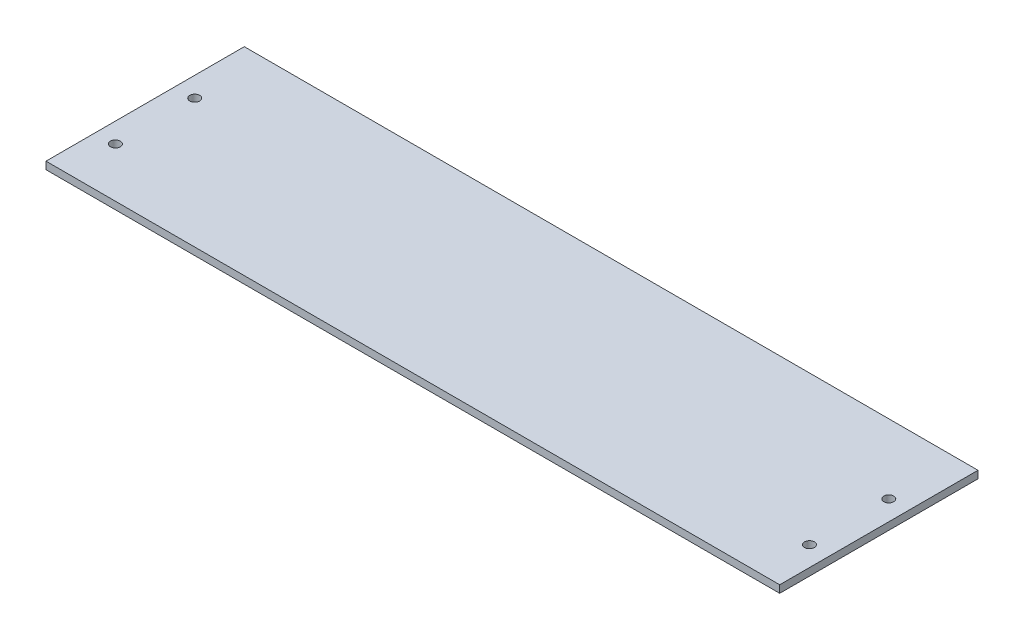
ISO-10303-21;
HEADER;
FILE_DESCRIPTION(('STEP AP214'),'2;1');
FILE_NAME('part.step','',(''),(''),'','','');
FILE_SCHEMA(('AUTOMOTIVE_DESIGN { 1 0 10303 214 1 1 1 1 }'));
ENDSEC;
DATA;
#1=APPLICATION_CONTEXT('core data for automotive mechanical design processes');
#2=APPLICATION_PROTOCOL_DEFINITION('international standard','automotive_design',2000,#1);
#3=PRODUCT_CONTEXT('',#1,'mechanical');
#4=PRODUCT('Part','Part','',(#3));
#5=PRODUCT_RELATED_PRODUCT_CATEGORY('part','',(#4));
#6=PRODUCT_DEFINITION_FORMATION('','',#4);
#7=PRODUCT_DEFINITION_CONTEXT('part definition',#1,'design');
#8=PRODUCT_DEFINITION('design','',#6,#7);
#9=PRODUCT_DEFINITION_SHAPE('','',#8);
#10=(LENGTH_UNIT() NAMED_UNIT(*) SI_UNIT(.MILLI.,.METRE.));
#11=(NAMED_UNIT(*) PLANE_ANGLE_UNIT() SI_UNIT($,.RADIAN.));
#12=(NAMED_UNIT(*) SI_UNIT($,.STERADIAN.) SOLID_ANGLE_UNIT());
#13=UNCERTAINTY_MEASURE_WITH_UNIT(LENGTH_MEASURE(1.E-05),#10,'distance_accuracy_value','');
#14=(GEOMETRIC_REPRESENTATION_CONTEXT(3) GLOBAL_UNCERTAINTY_ASSIGNED_CONTEXT((#13)) GLOBAL_UNIT_ASSIGNED_CONTEXT((#10,
#11,#12)) REPRESENTATION_CONTEXT('',''));
#15=CARTESIAN_POINT('',(0.,0.,0.));
#16=DIRECTION('',(0.,0.,1.));
#17=DIRECTION('',(1.,0.,0.));
#18=AXIS2_PLACEMENT_3D('',#15,#16,#17);
#19=CARTESIAN_POINT('',(0.,3.,0.));
#20=DIRECTION('',(0.,1.,0.));
#21=DIRECTION('',(0.,0.,1.));
#22=AXIS2_PLACEMENT_3D('',#19,#20,#21);
#23=PLANE('',#22);
#24=CARTESIAN_POINT('',(-288.,3.,-52.));
#25=DIRECTION('',(0.,1.,0.));
#26=DIRECTION('',(0.,0.,-1.));
#27=AXIS2_PLACEMENT_3D('',#24,#25,#26);
#28=CIRCLE('',#27,2.);
#29=CARTESIAN_POINT('',(-288.,3.,-54.));
#30=VERTEX_POINT('',#29);
#31=EDGE_CURVE('E148',#30,#30,#28,.T.);
#32=ORIENTED_EDGE('',*,*,#31,.F.);
#33=EDGE_LOOP('',(#32));
#34=FACE_BOUND('',#33,.T.);
#35=CARTESIAN_POINT('',(-8.,3.,-20.));
#36=DIRECTION('',(0.,1.,0.));
#37=DIRECTION('',(0.,0.,1.));
#38=AXIS2_PLACEMENT_3D('',#35,#36,#37);
#39=CIRCLE('',#38,2.);
#40=CARTESIAN_POINT('',(-8.,3.,-18.));
#41=VERTEX_POINT('',#40);
#42=EDGE_CURVE('E118',#41,#41,#39,.T.);
#43=ORIENTED_EDGE('',*,*,#42,.F.);
#44=EDGE_LOOP('',(#43));
#45=FACE_BOUND('',#44,.T.);
#46=DIRECTION('',(0.,0.,-1.));
#47=VECTOR('',#46,1.);
#48=CARTESIAN_POINT('',(0.,3.,0.));
#49=LINE('',#48,#47);
#50=CARTESIAN_POINT('',(0.,3.,0.));
#51=VERTEX_POINT('',#50);
#52=CARTESIAN_POINT('',(0.,3.,-80.));
#53=VERTEX_POINT('',#52);
#54=EDGE_CURVE('E98',#51,#53,#49,.T.);
#55=ORIENTED_EDGE('',*,*,#54,.T.);
#56=DIRECTION('',(-1.,0.,0.));
#57=VECTOR('',#56,1.);
#58=CARTESIAN_POINT('',(0.,3.,-80.));
#59=LINE('',#58,#57);
#60=CARTESIAN_POINT('',(-296.,3.,-80.));
#61=VERTEX_POINT('',#60);
#62=EDGE_CURVE('E93',#53,#61,#59,.T.);
#63=ORIENTED_EDGE('',*,*,#62,.T.);
#64=DIRECTION('',(0.,0.,1.));
#65=VECTOR('',#64,1.);
#66=CARTESIAN_POINT('',(-296.,3.,0.));
#67=LINE('',#66,#65);
#68=CARTESIAN_POINT('',(-296.,3.,0.));
#69=VERTEX_POINT('',#68);
#70=EDGE_CURVE('E96',#61,#69,#67,.T.);
#71=ORIENTED_EDGE('',*,*,#70,.T.);
#72=DIRECTION('',(1.,0.,0.));
#73=VECTOR('',#72,1.);
#74=CARTESIAN_POINT('',(0.,3.,0.));
#75=LINE('',#74,#73);
#76=EDGE_CURVE('E63',#69,#51,#75,.T.);
#77=ORIENTED_EDGE('',*,*,#76,.T.);
#78=EDGE_LOOP('',(#55,#63,#71,#77));
#79=FACE_BOUND('',#78,.T.);
#80=CARTESIAN_POINT('',(-8.,3.,-52.));
#81=DIRECTION('',(0.,1.,0.));
#82=DIRECTION('',(0.,0.,1.));
#83=AXIS2_PLACEMENT_3D('',#80,#81,#82);
#84=CIRCLE('',#83,2.);
#85=CARTESIAN_POINT('',(-8.,3.,-50.));
#86=VERTEX_POINT('',#85);
#87=EDGE_CURVE('E140',#86,#86,#84,.T.);
#88=ORIENTED_EDGE('',*,*,#87,.F.);
#89=EDGE_LOOP('',(#88));
#90=FACE_BOUND('',#89,.T.);
#91=CARTESIAN_POINT('',(-288.,3.,-20.));
#92=DIRECTION('',(0.,1.,0.));
#93=DIRECTION('',(0.,0.,-1.));
#94=AXIS2_PLACEMENT_3D('',#91,#92,#93);
#95=CIRCLE('',#94,2.);
#96=CARTESIAN_POINT('',(-288.,3.,-22.));
#97=VERTEX_POINT('',#96);
#98=EDGE_CURVE('E156',#97,#97,#95,.T.);
#99=ORIENTED_EDGE('',*,*,#98,.F.);
#100=EDGE_LOOP('',(#99));
#101=FACE_BOUND('',#100,.T.);
#102=ADVANCED_FACE('F45',(#34,#45,#79,#90,#101),#23,.T.);
#103=CARTESIAN_POINT('',(0.,0.,0.));
#104=DIRECTION('',(0.,1.,0.));
#105=DIRECTION('',(0.,0.,1.));
#106=AXIS2_PLACEMENT_3D('',#103,#104,#105);
#107=PLANE('',#106);
#108=DIRECTION('',(0.,0.,-1.));
#109=VECTOR('',#108,1.);
#110=CARTESIAN_POINT('',(0.,0.,0.));
#111=LINE('',#110,#109);
#112=CARTESIAN_POINT('',(0.,0.,0.));
#113=VERTEX_POINT('',#112);
#114=CARTESIAN_POINT('',(0.,0.,-80.));
#115=VERTEX_POINT('',#114);
#116=EDGE_CURVE('E114',#113,#115,#111,.T.);
#117=ORIENTED_EDGE('',*,*,#116,.F.);
#118=DIRECTION('',(1.,0.,0.));
#119=VECTOR('',#118,1.);
#120=CARTESIAN_POINT('',(0.,0.,0.));
#121=LINE('',#120,#119);
#122=CARTESIAN_POINT('',(-296.,0.,0.));
#123=VERTEX_POINT('',#122);
#124=EDGE_CURVE('E86',#123,#113,#121,.T.);
#125=ORIENTED_EDGE('',*,*,#124,.F.);
#126=DIRECTION('',(0.,0.,1.));
#127=VECTOR('',#126,1.);
#128=CARTESIAN_POINT('',(-296.,0.,0.));
#129=LINE('',#128,#127);
#130=CARTESIAN_POINT('',(-296.,0.,-80.));
#131=VERTEX_POINT('',#130);
#132=EDGE_CURVE('E80',#131,#123,#129,.T.);
#133=ORIENTED_EDGE('',*,*,#132,.F.);
#134=DIRECTION('',(-1.,0.,0.));
#135=VECTOR('',#134,1.);
#136=CARTESIAN_POINT('',(0.,0.,-80.));
#137=LINE('',#136,#135);
#138=EDGE_CURVE('E103',#115,#131,#137,.T.);
#139=ORIENTED_EDGE('',*,*,#138,.F.);
#140=EDGE_LOOP('',(#117,#125,#133,#139));
#141=FACE_BOUND('',#140,.T.);
#142=CARTESIAN_POINT('',(-8.,0.,-20.));
#143=DIRECTION('',(0.,1.,0.));
#144=DIRECTION('',(0.,0.,1.));
#145=AXIS2_PLACEMENT_3D('',#142,#143,#144);
#146=CIRCLE('',#145,2.);
#147=CARTESIAN_POINT('',(-8.,0.,-18.));
#148=VERTEX_POINT('',#147);
#149=EDGE_CURVE('E136',#148,#148,#146,.T.);
#150=ORIENTED_EDGE('',*,*,#149,.T.);
#151=EDGE_LOOP('',(#150));
#152=FACE_BOUND('',#151,.T.);
#153=CARTESIAN_POINT('',(-8.,0.,-52.));
#154=DIRECTION('',(0.,1.,0.));
#155=DIRECTION('',(0.,0.,1.));
#156=AXIS2_PLACEMENT_3D('',#153,#154,#155);
#157=CIRCLE('',#156,2.);
#158=CARTESIAN_POINT('',(-8.,0.,-50.));
#159=VERTEX_POINT('',#158);
#160=EDGE_CURVE('E144',#159,#159,#157,.T.);
#161=ORIENTED_EDGE('',*,*,#160,.T.);
#162=EDGE_LOOP('',(#161));
#163=FACE_BOUND('',#162,.T.);
#164=CARTESIAN_POINT('',(-288.,0.,-52.));
#165=DIRECTION('',(0.,1.,0.));
#166=DIRECTION('',(0.,0.,-1.));
#167=AXIS2_PLACEMENT_3D('',#164,#165,#166);
#168=CIRCLE('',#167,2.);
#169=CARTESIAN_POINT('',(-288.,0.,-54.));
#170=VERTEX_POINT('',#169);
#171=EDGE_CURVE('E152',#170,#170,#168,.T.);
#172=ORIENTED_EDGE('',*,*,#171,.T.);
#173=EDGE_LOOP('',(#172));
#174=FACE_BOUND('',#173,.T.);
#175=CARTESIAN_POINT('',(-288.,0.,-20.));
#176=DIRECTION('',(0.,1.,0.));
#177=DIRECTION('',(0.,0.,-1.));
#178=AXIS2_PLACEMENT_3D('',#175,#176,#177);
#179=CIRCLE('',#178,2.);
#180=CARTESIAN_POINT('',(-288.,0.,-22.));
#181=VERTEX_POINT('',#180);
#182=EDGE_CURVE('E160',#181,#181,#179,.T.);
#183=ORIENTED_EDGE('',*,*,#182,.T.);
#184=EDGE_LOOP('',(#183));
#185=FACE_BOUND('',#184,.T.);
#186=ADVANCED_FACE('F131',(#141,#152,#163,#174,#185),#107,.F.);
#187=CARTESIAN_POINT('',(0.,3.,0.));
#188=DIRECTION('',(-1.,0.,0.));
#189=DIRECTION('',(0.,0.,1.));
#190=AXIS2_PLACEMENT_3D('',#187,#188,#189);
#191=PLANE('',#190);
#192=ORIENTED_EDGE('',*,*,#116,.T.);
#193=DIRECTION('',(0.,-1.,0.));
#194=VECTOR('',#193,1.);
#195=CARTESIAN_POINT('',(0.,3.,-80.));
#196=LINE('',#195,#194);
#197=EDGE_CURVE('E11',#53,#115,#196,.T.);
#198=ORIENTED_EDGE('',*,*,#197,.F.);
#199=ORIENTED_EDGE('',*,*,#54,.F.);
#200=DIRECTION('',(0.,-1.,0.));
#201=VECTOR('',#200,1.);
#202=CARTESIAN_POINT('',(0.,3.,0.));
#203=LINE('',#202,#201);
#204=EDGE_CURVE('E110',#51,#113,#203,.T.);
#205=ORIENTED_EDGE('',*,*,#204,.T.);
#206=EDGE_LOOP('',(#192,#198,#199,#205));
#207=FACE_BOUND('',#206,.T.);
#208=ADVANCED_FACE('F47',(#207),#191,.F.);
#209=CARTESIAN_POINT('',(0.,3.,-80.));
#210=DIRECTION('',(0.,0.,1.));
#211=DIRECTION('',(1.,0.,0.));
#212=AXIS2_PLACEMENT_3D('',#209,#210,#211);
#213=PLANE('',#212);
#214=ORIENTED_EDGE('',*,*,#138,.T.);
#215=DIRECTION('',(0.,-1.,0.));
#216=VECTOR('',#215,1.);
#217=CARTESIAN_POINT('',(-296.,3.,-80.));
#218=LINE('',#217,#216);
#219=EDGE_CURVE('E55',#61,#131,#218,.T.);
#220=ORIENTED_EDGE('',*,*,#219,.F.);
#221=ORIENTED_EDGE('',*,*,#62,.F.);
#222=ORIENTED_EDGE('',*,*,#197,.T.);
#223=EDGE_LOOP('',(#214,#220,#221,#222));
#224=FACE_BOUND('',#223,.T.);
#225=ADVANCED_FACE('F102',(#224),#213,.F.);
#226=CARTESIAN_POINT('',(-296.,3.,0.));
#227=DIRECTION('',(1.,0.,0.));
#228=DIRECTION('',(0.,0.,-1.));
#229=AXIS2_PLACEMENT_3D('',#226,#227,#228);
#230=PLANE('',#229);
#231=ORIENTED_EDGE('',*,*,#132,.T.);
#232=DIRECTION('',(0.,-1.,0.));
#233=VECTOR('',#232,1.);
#234=CARTESIAN_POINT('',(-296.,3.,0.));
#235=LINE('',#234,#233);
#236=EDGE_CURVE('E105',#69,#123,#235,.T.);
#237=ORIENTED_EDGE('',*,*,#236,.F.);
#238=ORIENTED_EDGE('',*,*,#70,.F.);
#239=ORIENTED_EDGE('',*,*,#219,.T.);
#240=EDGE_LOOP('',(#231,#237,#238,#239));
#241=FACE_BOUND('',#240,.T.);
#242=ADVANCED_FACE('F106',(#241),#230,.F.);
#243=CARTESIAN_POINT('',(0.,3.,0.));
#244=DIRECTION('',(0.,0.,-1.));
#245=DIRECTION('',(-1.,0.,0.));
#246=AXIS2_PLACEMENT_3D('',#243,#244,#245);
#247=PLANE('',#246);
#248=ORIENTED_EDGE('',*,*,#124,.T.);
#249=ORIENTED_EDGE('',*,*,#204,.F.);
#250=ORIENTED_EDGE('',*,*,#76,.F.);
#251=ORIENTED_EDGE('',*,*,#236,.T.);
#252=EDGE_LOOP('',(#248,#249,#250,#251));
#253=FACE_BOUND('',#252,.T.);
#254=ADVANCED_FACE('F128',(#253),#247,.F.);
#255=CARTESIAN_POINT('',(-8.,3.,-20.));
#256=DIRECTION('',(0.,-1.,0.));
#257=DIRECTION('',(0.,0.,-1.));
#258=AXIS2_PLACEMENT_3D('',#255,#256,#257);
#259=CYLINDRICAL_SURFACE('',#258,2.);
#260=ORIENTED_EDGE('',*,*,#42,.T.);
#261=EDGE_LOOP('',(#260));
#262=FACE_BOUND('',#261,.T.);
#263=ORIENTED_EDGE('',*,*,#149,.F.);
#264=EDGE_LOOP('',(#263));
#265=FACE_BOUND('',#264,.T.);
#266=ADVANCED_FACE('F181',(#262,#265),#259,.F.);
#267=CARTESIAN_POINT('',(-8.,3.,-52.));
#268=DIRECTION('',(0.,-1.,0.));
#269=DIRECTION('',(0.,0.,-1.));
#270=AXIS2_PLACEMENT_3D('',#267,#268,#269);
#271=CYLINDRICAL_SURFACE('',#270,2.);
#272=ORIENTED_EDGE('',*,*,#87,.T.);
#273=EDGE_LOOP('',(#272));
#274=FACE_BOUND('',#273,.T.);
#275=ORIENTED_EDGE('',*,*,#160,.F.);
#276=EDGE_LOOP('',(#275));
#277=FACE_BOUND('',#276,.T.);
#278=ADVANCED_FACE('F226',(#274,#277),#271,.F.);
#279=CARTESIAN_POINT('',(-288.,3.,-52.));
#280=DIRECTION('',(0.,-1.,0.));
#281=DIRECTION('',(0.,0.,-1.));
#282=AXIS2_PLACEMENT_3D('',#279,#280,#281);
#283=CYLINDRICAL_SURFACE('',#282,2.);
#284=ORIENTED_EDGE('',*,*,#31,.T.);
#285=EDGE_LOOP('',(#284));
#286=FACE_BOUND('',#285,.T.);
#287=ORIENTED_EDGE('',*,*,#171,.F.);
#288=EDGE_LOOP('',(#287));
#289=FACE_BOUND('',#288,.T.);
#290=ADVANCED_FACE('F234',(#286,#289),#283,.F.);
#291=CARTESIAN_POINT('',(-288.,3.,-20.));
#292=DIRECTION('',(0.,-1.,0.));
#293=DIRECTION('',(0.,0.,-1.));
#294=AXIS2_PLACEMENT_3D('',#291,#292,#293);
#295=CYLINDRICAL_SURFACE('',#294,2.);
#296=ORIENTED_EDGE('',*,*,#98,.T.);
#297=EDGE_LOOP('',(#296));
#298=FACE_BOUND('',#297,.T.);
#299=ORIENTED_EDGE('',*,*,#182,.F.);
#300=EDGE_LOOP('',(#299));
#301=FACE_BOUND('',#300,.T.);
#302=ADVANCED_FACE('F168',(#298,#301),#295,.F.);
#303=CLOSED_SHELL('',(#102,#186,#208,#225,#242,#254,#266,#278,#290,#302));
#304=MANIFOLD_SOLID_BREP('B2',#303);
#305=ADVANCED_BREP_SHAPE_REPRESENTATION('',(#18,#304),#14);
#306=SHAPE_DEFINITION_REPRESENTATION(#9,#305);
ENDSEC;
END-ISO-10303-21;
